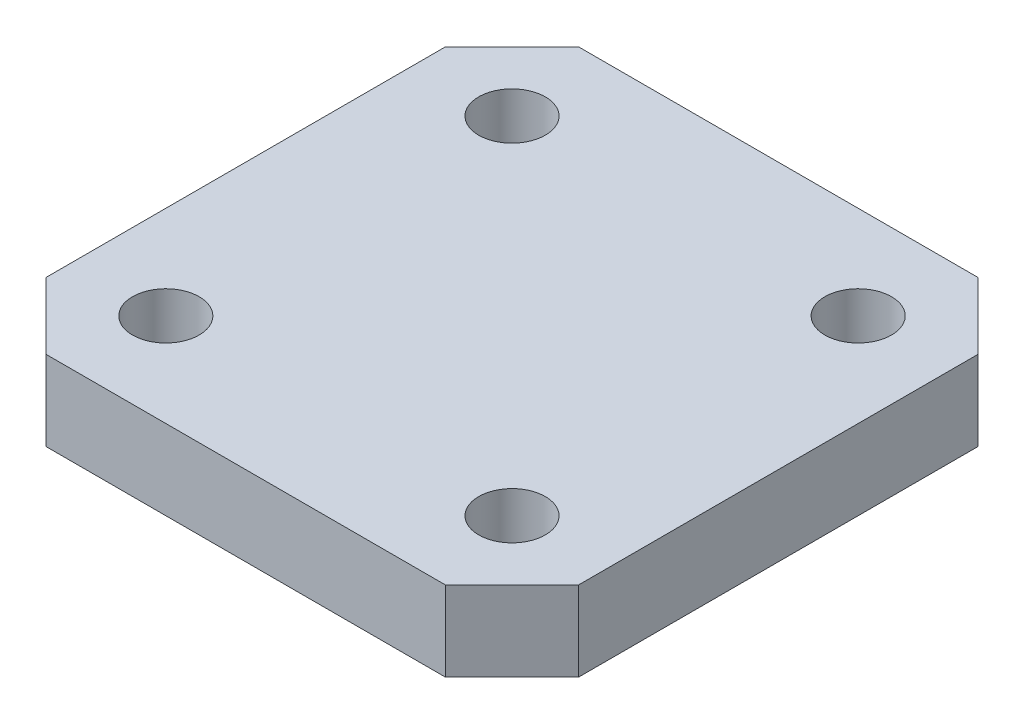
ISO-10303-21;
HEADER;
FILE_DESCRIPTION(('STEP AP214'),'2;1');
FILE_NAME('part.step','',(''),(''),'','','');
FILE_SCHEMA(('AUTOMOTIVE_DESIGN { 1 0 10303 214 1 1 1 1 }'));
ENDSEC;
DATA;
#1=APPLICATION_CONTEXT('core data for automotive mechanical design processes');
#2=APPLICATION_PROTOCOL_DEFINITION('international standard','automotive_design',2000,#1);
#3=PRODUCT_CONTEXT('',#1,'mechanical');
#4=PRODUCT('Part','Part','',(#3));
#5=PRODUCT_RELATED_PRODUCT_CATEGORY('part','',(#4));
#6=PRODUCT_DEFINITION_FORMATION('','',#4);
#7=PRODUCT_DEFINITION_CONTEXT('part definition',#1,'design');
#8=PRODUCT_DEFINITION('design','',#6,#7);
#9=PRODUCT_DEFINITION_SHAPE('','',#8);
#10=(LENGTH_UNIT() NAMED_UNIT(*) SI_UNIT(.MILLI.,.METRE.));
#11=(NAMED_UNIT(*) PLANE_ANGLE_UNIT() SI_UNIT($,.RADIAN.));
#12=(NAMED_UNIT(*) SI_UNIT($,.STERADIAN.) SOLID_ANGLE_UNIT());
#13=UNCERTAINTY_MEASURE_WITH_UNIT(LENGTH_MEASURE(1.E-05),#10,'distance_accuracy_value','');
#14=(GEOMETRIC_REPRESENTATION_CONTEXT(3) GLOBAL_UNCERTAINTY_ASSIGNED_CONTEXT((#13)) GLOBAL_UNIT_ASSIGNED_CONTEXT((#10,
#11,#12)) REPRESENTATION_CONTEXT('',''));
#15=CARTESIAN_POINT('',(0.,0.,0.));
#16=DIRECTION('',(0.,0.,1.));
#17=DIRECTION('',(1.,0.,0.));
#18=AXIS2_PLACEMENT_3D('',#15,#16,#17);
#19=CARTESIAN_POINT('',(-750.,930.,-880.));
#20=DIRECTION('',(0.,1.,0.));
#21=DIRECTION('',(0.,0.,1.));
#22=AXIS2_PLACEMENT_3D('',#19,#20,#21);
#23=PLANE('',#22);
#24=CARTESIAN_POINT('',(-763.,930.,-893.));
#25=DIRECTION('',(0.,1.,0.));
#26=DIRECTION('',(0.,0.,1.));
#27=AXIS2_PLACEMENT_3D('',#24,#25,#26);
#28=CIRCLE('',#27,2.49999999999995);
#29=CARTESIAN_POINT('',(-763.,930.,-890.5));
#30=VERTEX_POINT('',#29);
#31=EDGE_CURVE('E175',#30,#30,#28,.T.);
#32=ORIENTED_EDGE('',*,*,#31,.T.);
#33=EDGE_LOOP('',(#32));
#34=FACE_BOUND('',#33,.T.);
#35=CARTESIAN_POINT('',(-763.,930.,-867.));
#36=DIRECTION('',(0.,1.,0.));
#37=DIRECTION('',(0.,0.,1.));
#38=AXIS2_PLACEMENT_3D('',#35,#36,#37);
#39=CIRCLE('',#38,2.49999999999995);
#40=CARTESIAN_POINT('',(-763.,930.,-864.5));
#41=VERTEX_POINT('',#40);
#42=EDGE_CURVE('E237',#41,#41,#39,.T.);
#43=ORIENTED_EDGE('',*,*,#42,.T.);
#44=EDGE_LOOP('',(#43));
#45=FACE_BOUND('',#44,.T.);
#46=CARTESIAN_POINT('',(-737.,930.,-867.));
#47=DIRECTION('',(0.,1.,0.));
#48=DIRECTION('',(0.,0.,1.));
#49=AXIS2_PLACEMENT_3D('',#46,#47,#48);
#50=CIRCLE('',#49,2.49999999999995);
#51=CARTESIAN_POINT('',(-737.,930.,-864.5));
#52=VERTEX_POINT('',#51);
#53=EDGE_CURVE('E239',#52,#52,#50,.T.);
#54=ORIENTED_EDGE('',*,*,#53,.T.);
#55=EDGE_LOOP('',(#54));
#56=FACE_BOUND('',#55,.T.);
#57=CARTESIAN_POINT('',(-737.,930.,-893.));
#58=DIRECTION('',(0.,1.,0.));
#59=DIRECTION('',(0.,0.,1.));
#60=AXIS2_PLACEMENT_3D('',#57,#58,#59);
#61=CIRCLE('',#60,2.49999999999995);
#62=CARTESIAN_POINT('',(-737.,930.,-890.5));
#63=VERTEX_POINT('',#62);
#64=EDGE_CURVE('E48',#63,#63,#61,.T.);
#65=ORIENTED_EDGE('',*,*,#64,.T.);
#66=EDGE_LOOP('',(#65));
#67=FACE_BOUND('',#66,.T.);
#68=DIRECTION('',(1.,0.,0.));
#69=VECTOR('',#68,1.);
#70=CARTESIAN_POINT('',(-770.,930.,-900.));
#71=LINE('',#70,#69);
#72=CARTESIAN_POINT('',(-765.,930.,-900.));
#73=VERTEX_POINT('',#72);
#74=CARTESIAN_POINT('',(-735.,930.,-900.));
#75=VERTEX_POINT('',#74);
#76=EDGE_CURVE('E120',#73,#75,#71,.T.);
#77=ORIENTED_EDGE('',*,*,#76,.T.);
#78=DIRECTION('',(0.707106781186547,0.,0.707106781186549));
#79=VECTOR('',#78,1.);
#80=CARTESIAN_POINT('',(-735.,930.,-900.));
#81=LINE('',#80,#79);
#82=CARTESIAN_POINT('',(-730.,930.,-895.));
#83=VERTEX_POINT('',#82);
#84=EDGE_CURVE('E124',#75,#83,#81,.T.);
#85=ORIENTED_EDGE('',*,*,#84,.T.);
#86=DIRECTION('',(0.,0.,1.));
#87=VECTOR('',#86,1.);
#88=CARTESIAN_POINT('',(-730.,930.,-900.));
#89=LINE('',#88,#87);
#90=CARTESIAN_POINT('',(-730.,930.,-865.));
#91=VERTEX_POINT('',#90);
#92=EDGE_CURVE('E126',#83,#91,#89,.T.);
#93=ORIENTED_EDGE('',*,*,#92,.T.);
#94=DIRECTION('',(-0.707106781186549,0.,0.707106781186546));
#95=VECTOR('',#94,1.);
#96=CARTESIAN_POINT('',(-730.,930.,-865.));
#97=LINE('',#96,#95);
#98=CARTESIAN_POINT('',(-735.,930.,-860.));
#99=VERTEX_POINT('',#98);
#100=EDGE_CURVE('E179',#91,#99,#97,.T.);
#101=ORIENTED_EDGE('',*,*,#100,.T.);
#102=DIRECTION('',(-1.,0.,0.));
#103=VECTOR('',#102,1.);
#104=CARTESIAN_POINT('',(-770.,930.,-860.));
#105=LINE('',#104,#103);
#106=CARTESIAN_POINT('',(-765.,930.,-860.));
#107=VERTEX_POINT('',#106);
#108=EDGE_CURVE('E185',#99,#107,#105,.T.);
#109=ORIENTED_EDGE('',*,*,#108,.T.);
#110=DIRECTION('',(-0.707106781186546,0.,-0.707106781186549));
#111=VECTOR('',#110,1.);
#112=CARTESIAN_POINT('',(-765.,930.,-860.));
#113=LINE('',#112,#111);
#114=CARTESIAN_POINT('',(-770.,930.,-865.));
#115=VERTEX_POINT('',#114);
#116=EDGE_CURVE('E188',#107,#115,#113,.T.);
#117=ORIENTED_EDGE('',*,*,#116,.T.);
#118=DIRECTION('',(0.,0.,-1.));
#119=VECTOR('',#118,1.);
#120=CARTESIAN_POINT('',(-770.,930.,-900.));
#121=LINE('',#120,#119);
#122=CARTESIAN_POINT('',(-770.,930.,-895.));
#123=VERTEX_POINT('',#122);
#124=EDGE_CURVE('E192',#115,#123,#121,.T.);
#125=ORIENTED_EDGE('',*,*,#124,.T.);
#126=DIRECTION('',(0.707106781186548,0.,-0.707106781186547));
#127=VECTOR('',#126,1.);
#128=CARTESIAN_POINT('',(-770.,930.,-895.));
#129=LINE('',#128,#127);
#130=EDGE_CURVE('E154',#123,#73,#129,.T.);
#131=ORIENTED_EDGE('',*,*,#130,.T.);
#132=EDGE_LOOP('',(#77,#85,#93,#101,#109,#117,#125,#131));
#133=FACE_BOUND('',#132,.T.);
#134=ADVANCED_FACE('F45',(#34,#45,#56,#67,#133),#23,.F.);
#135=CARTESIAN_POINT('',(-730.,936.,-900.));
#136=DIRECTION('',(-1.,0.,0.));
#137=DIRECTION('',(0.,0.,1.));
#138=AXIS2_PLACEMENT_3D('',#135,#136,#137);
#139=PLANE('',#138);
#140=DIRECTION('',(0.,0.,1.));
#141=VECTOR('',#140,1.);
#142=CARTESIAN_POINT('',(-730.,936.,-880.));
#143=LINE('',#142,#141);
#144=CARTESIAN_POINT('',(-730.,936.,-865.));
#145=VERTEX_POINT('',#144);
#146=CARTESIAN_POINT('',(-730.,936.,-895.));
#147=VERTEX_POINT('',#146);
#148=EDGE_CURVE('E173',#145,#147,#143,.F.);
#149=ORIENTED_EDGE('',*,*,#148,.F.);
#150=DIRECTION('',(0.,1.,0.));
#151=VECTOR('',#150,1.);
#152=CARTESIAN_POINT('',(-730.,936.,-865.));
#153=LINE('',#152,#151);
#154=EDGE_CURVE('E137',#145,#91,#153,.F.);
#155=ORIENTED_EDGE('',*,*,#154,.T.);
#156=ORIENTED_EDGE('',*,*,#92,.F.);
#157=DIRECTION('',(0.,1.,0.));
#158=VECTOR('',#157,1.);
#159=CARTESIAN_POINT('',(-730.,936.,-895.));
#160=LINE('',#159,#158);
#161=EDGE_CURVE('E131',#83,#147,#160,.T.);
#162=ORIENTED_EDGE('',*,*,#161,.T.);
#163=EDGE_LOOP('',(#149,#155,#156,#162));
#164=FACE_BOUND('',#163,.T.);
#165=ADVANCED_FACE('F134',(#164),#139,.F.);
#166=CARTESIAN_POINT('',(-735.,936.,-900.));
#167=DIRECTION('',(-0.707106781186549,0.,0.707106781186547));
#168=DIRECTION('',(0.707106781186547,0.,0.707106781186549));
#169=AXIS2_PLACEMENT_3D('',#166,#167,#168);
#170=PLANE('',#169);
#171=ORIENTED_EDGE('',*,*,#84,.F.);
#172=DIRECTION('',(0.,1.,0.));
#173=VECTOR('',#172,1.);
#174=CARTESIAN_POINT('',(-735.,936.,-900.));
#175=LINE('',#174,#173);
#176=CARTESIAN_POINT('',(-735.,936.,-900.));
#177=VERTEX_POINT('',#176);
#178=EDGE_CURVE('E145',#75,#177,#175,.T.);
#179=ORIENTED_EDGE('',*,*,#178,.T.);
#180=DIRECTION('',(-0.707106781186548,0.,-0.707106781186548));
#181=VECTOR('',#180,1.);
#182=CARTESIAN_POINT('',(-730.,936.,-895.));
#183=LINE('',#182,#181);
#184=EDGE_CURVE('E142',#147,#177,#183,.T.);
#185=ORIENTED_EDGE('',*,*,#184,.F.);
#186=ORIENTED_EDGE('',*,*,#161,.F.);
#187=EDGE_LOOP('',(#171,#179,#185,#186));
#188=FACE_BOUND('',#187,.T.);
#189=ADVANCED_FACE('F140',(#188),#170,.F.);
#190=CARTESIAN_POINT('',(-770.,936.,-900.));
#191=DIRECTION('',(0.,0.,1.));
#192=DIRECTION('',(1.,0.,0.));
#193=AXIS2_PLACEMENT_3D('',#190,#191,#192);
#194=PLANE('',#193);
#195=DIRECTION('',(1.,0.,0.));
#196=VECTOR('',#195,1.);
#197=CARTESIAN_POINT('',(-750.,936.,-900.));
#198=LINE('',#197,#196);
#199=CARTESIAN_POINT('',(-765.,936.,-900.));
#200=VERTEX_POINT('',#199);
#201=EDGE_CURVE('E162',#177,#200,#198,.F.);
#202=ORIENTED_EDGE('',*,*,#201,.F.);
#203=ORIENTED_EDGE('',*,*,#178,.F.);
#204=ORIENTED_EDGE('',*,*,#76,.F.);
#205=DIRECTION('',(0.,1.,0.));
#206=VECTOR('',#205,1.);
#207=CARTESIAN_POINT('',(-765.,936.,-900.));
#208=LINE('',#207,#206);
#209=EDGE_CURVE('E157',#73,#200,#208,.T.);
#210=ORIENTED_EDGE('',*,*,#209,.T.);
#211=EDGE_LOOP('',(#202,#203,#204,#210));
#212=FACE_BOUND('',#211,.T.);
#213=ADVANCED_FACE('F163',(#212),#194,.F.);
#214=CARTESIAN_POINT('',(-770.,936.,-895.));
#215=DIRECTION('',(0.707106781186547,0.,0.707106781186548));
#216=DIRECTION('',(0.707106781186548,0.,-0.707106781186547));
#217=AXIS2_PLACEMENT_3D('',#214,#215,#216);
#218=PLANE('',#217);
#219=ORIENTED_EDGE('',*,*,#130,.F.);
#220=DIRECTION('',(0.,1.,0.));
#221=VECTOR('',#220,1.);
#222=CARTESIAN_POINT('',(-770.,936.,-895.));
#223=LINE('',#222,#221);
#224=CARTESIAN_POINT('',(-770.,936.,-895.));
#225=VERTEX_POINT('',#224);
#226=EDGE_CURVE('E191',#123,#225,#223,.T.);
#227=ORIENTED_EDGE('',*,*,#226,.T.);
#228=DIRECTION('',(-0.707106781186548,0.,0.707106781186548));
#229=VECTOR('',#228,1.);
#230=CARTESIAN_POINT('',(-765.,936.,-900.));
#231=LINE('',#230,#229);
#232=EDGE_CURVE('E168',#200,#225,#231,.T.);
#233=ORIENTED_EDGE('',*,*,#232,.F.);
#234=ORIENTED_EDGE('',*,*,#209,.F.);
#235=EDGE_LOOP('',(#219,#227,#233,#234));
#236=FACE_BOUND('',#235,.T.);
#237=ADVANCED_FACE('F211',(#236),#218,.F.);
#238=CARTESIAN_POINT('',(-770.,936.,-900.));
#239=DIRECTION('',(1.,0.,0.));
#240=DIRECTION('',(0.,0.,-1.));
#241=AXIS2_PLACEMENT_3D('',#238,#239,#240);
#242=PLANE('',#241);
#243=ORIENTED_EDGE('',*,*,#124,.F.);
#244=DIRECTION('',(0.,1.,0.));
#245=VECTOR('',#244,1.);
#246=CARTESIAN_POINT('',(-770.,936.,-865.));
#247=LINE('',#246,#245);
#248=CARTESIAN_POINT('',(-770.,936.,-865.));
#249=VERTEX_POINT('',#248);
#250=EDGE_CURVE('E187',#115,#249,#247,.T.);
#251=ORIENTED_EDGE('',*,*,#250,.T.);
#252=DIRECTION('',(0.,0.,1.));
#253=VECTOR('',#252,1.);
#254=CARTESIAN_POINT('',(-770.,936.,-880.));
#255=LINE('',#254,#253);
#256=EDGE_CURVE('E206',#225,#249,#255,.T.);
#257=ORIENTED_EDGE('',*,*,#256,.F.);
#258=ORIENTED_EDGE('',*,*,#226,.F.);
#259=EDGE_LOOP('',(#243,#251,#257,#258));
#260=FACE_BOUND('',#259,.T.);
#261=ADVANCED_FACE('F215',(#260),#242,.F.);
#262=CARTESIAN_POINT('',(-765.,936.,-860.));
#263=DIRECTION('',(0.707106781186549,0.,-0.707106781186546));
#264=DIRECTION('',(-0.707106781186546,0.,-0.707106781186549));
#265=AXIS2_PLACEMENT_3D('',#262,#263,#264);
#266=PLANE('',#265);
#267=ORIENTED_EDGE('',*,*,#116,.F.);
#268=DIRECTION('',(0.,1.,0.));
#269=VECTOR('',#268,1.);
#270=CARTESIAN_POINT('',(-765.,936.,-860.));
#271=LINE('',#270,#269);
#272=CARTESIAN_POINT('',(-765.,936.,-860.));
#273=VERTEX_POINT('',#272);
#274=EDGE_CURVE('E183',#107,#273,#271,.T.);
#275=ORIENTED_EDGE('',*,*,#274,.T.);
#276=DIRECTION('',(0.707106781186548,0.,0.707106781186548));
#277=VECTOR('',#276,1.);
#278=CARTESIAN_POINT('',(-770.,936.,-865.));
#279=LINE('',#278,#277);
#280=EDGE_CURVE('E203',#249,#273,#279,.T.);
#281=ORIENTED_EDGE('',*,*,#280,.F.);
#282=ORIENTED_EDGE('',*,*,#250,.F.);
#283=EDGE_LOOP('',(#267,#275,#281,#282));
#284=FACE_BOUND('',#283,.T.);
#285=ADVANCED_FACE('F220',(#284),#266,.F.);
#286=CARTESIAN_POINT('',(-770.,936.,-860.));
#287=DIRECTION('',(0.,0.,-1.));
#288=DIRECTION('',(-1.,0.,0.));
#289=AXIS2_PLACEMENT_3D('',#286,#287,#288);
#290=PLANE('',#289);
#291=DIRECTION('',(1.,0.,0.));
#292=VECTOR('',#291,1.);
#293=CARTESIAN_POINT('',(-750.,936.,-860.));
#294=LINE('',#293,#292);
#295=CARTESIAN_POINT('',(-735.,936.,-860.));
#296=VERTEX_POINT('',#295);
#297=EDGE_CURVE('E198',#273,#296,#294,.T.);
#298=ORIENTED_EDGE('',*,*,#297,.F.);
#299=ORIENTED_EDGE('',*,*,#274,.F.);
#300=ORIENTED_EDGE('',*,*,#108,.F.);
#301=DIRECTION('',(0.,1.,0.));
#302=VECTOR('',#301,1.);
#303=CARTESIAN_POINT('',(-735.,936.,-860.));
#304=LINE('',#303,#302);
#305=EDGE_CURVE('E66',#99,#296,#304,.T.);
#306=ORIENTED_EDGE('',*,*,#305,.T.);
#307=EDGE_LOOP('',(#298,#299,#300,#306));
#308=FACE_BOUND('',#307,.T.);
#309=ADVANCED_FACE('F222',(#308),#290,.F.);
#310=CARTESIAN_POINT('',(-730.,936.,-865.));
#311=DIRECTION('',(-0.707106781186546,0.,-0.707106781186549));
#312=DIRECTION('',(-0.707106781186549,0.,0.707106781186546));
#313=AXIS2_PLACEMENT_3D('',#310,#311,#312);
#314=PLANE('',#313);
#315=ORIENTED_EDGE('',*,*,#100,.F.);
#316=ORIENTED_EDGE('',*,*,#154,.F.);
#317=DIRECTION('',(0.707106781186548,0.,-0.707106781186548));
#318=VECTOR('',#317,1.);
#319=CARTESIAN_POINT('',(-735.,936.,-860.));
#320=LINE('',#319,#318);
#321=EDGE_CURVE('E202',#296,#145,#320,.T.);
#322=ORIENTED_EDGE('',*,*,#321,.F.);
#323=ORIENTED_EDGE('',*,*,#305,.F.);
#324=EDGE_LOOP('',(#315,#316,#322,#323));
#325=FACE_BOUND('',#324,.T.);
#326=ADVANCED_FACE('F224',(#325),#314,.F.);
#327=CARTESIAN_POINT('',(-737.,936.,-893.));
#328=DIRECTION('',(0.,1.,0.));
#329=DIRECTION('',(0.,0.,1.));
#330=AXIS2_PLACEMENT_3D('',#327,#328,#329);
#331=CYLINDRICAL_SURFACE('',#330,2.49999999999995);
#332=ORIENTED_EDGE('',*,*,#64,.F.);
#333=EDGE_LOOP('',(#332));
#334=FACE_BOUND('',#333,.T.);
#335=CARTESIAN_POINT('',(-737.,936.,-893.));
#336=DIRECTION('',(0.,1.,0.));
#337=DIRECTION('',(0.,0.,1.));
#338=AXIS2_PLACEMENT_3D('',#335,#336,#337);
#339=CIRCLE('',#338,2.49999999999995);
#340=CARTESIAN_POINT('',(-737.,936.,-890.5));
#341=VERTEX_POINT('',#340);
#342=EDGE_CURVE('E225',#341,#341,#339,.F.);
#343=ORIENTED_EDGE('',*,*,#342,.F.);
#344=EDGE_LOOP('',(#343));
#345=FACE_BOUND('',#344,.T.);
#346=ADVANCED_FACE('F247',(#334,#345),#331,.F.);
#347=CARTESIAN_POINT('',(-737.,936.,-867.));
#348=DIRECTION('',(0.,1.,0.));
#349=DIRECTION('',(0.,0.,1.));
#350=AXIS2_PLACEMENT_3D('',#347,#348,#349);
#351=CYLINDRICAL_SURFACE('',#350,2.49999999999995);
#352=ORIENTED_EDGE('',*,*,#53,.F.);
#353=EDGE_LOOP('',(#352));
#354=FACE_BOUND('',#353,.T.);
#355=CARTESIAN_POINT('',(-737.,936.,-867.));
#356=DIRECTION('',(0.,1.,0.));
#357=DIRECTION('',(0.,0.,1.));
#358=AXIS2_PLACEMENT_3D('',#355,#356,#357);
#359=CIRCLE('',#358,2.49999999999995);
#360=CARTESIAN_POINT('',(-737.,936.,-864.5));
#361=VERTEX_POINT('',#360);
#362=EDGE_CURVE('E227',#361,#361,#359,.F.);
#363=ORIENTED_EDGE('',*,*,#362,.F.);
#364=EDGE_LOOP('',(#363));
#365=FACE_BOUND('',#364,.T.);
#366=ADVANCED_FACE('F250',(#354,#365),#351,.F.);
#367=CARTESIAN_POINT('',(-763.,936.,-867.));
#368=DIRECTION('',(0.,1.,0.));
#369=DIRECTION('',(0.,0.,1.));
#370=AXIS2_PLACEMENT_3D('',#367,#368,#369);
#371=CYLINDRICAL_SURFACE('',#370,2.49999999999995);
#372=ORIENTED_EDGE('',*,*,#42,.F.);
#373=EDGE_LOOP('',(#372));
#374=FACE_BOUND('',#373,.T.);
#375=CARTESIAN_POINT('',(-763.,936.,-867.));
#376=DIRECTION('',(0.,1.,0.));
#377=DIRECTION('',(0.,0.,1.));
#378=AXIS2_PLACEMENT_3D('',#375,#376,#377);
#379=CIRCLE('',#378,2.49999999999995);
#380=CARTESIAN_POINT('',(-763.,936.,-864.5));
#381=VERTEX_POINT('',#380);
#382=EDGE_CURVE('E54',#381,#381,#379,.F.);
#383=ORIENTED_EDGE('',*,*,#382,.F.);
#384=EDGE_LOOP('',(#383));
#385=FACE_BOUND('',#384,.T.);
#386=ADVANCED_FACE('F256',(#374,#385),#371,.F.);
#387=CARTESIAN_POINT('',(-763.,936.,-893.));
#388=DIRECTION('',(0.,1.,0.));
#389=DIRECTION('',(0.,0.,1.));
#390=AXIS2_PLACEMENT_3D('',#387,#388,#389);
#391=CYLINDRICAL_SURFACE('',#390,2.49999999999995);
#392=ORIENTED_EDGE('',*,*,#31,.F.);
#393=EDGE_LOOP('',(#392));
#394=FACE_BOUND('',#393,.T.);
#395=CARTESIAN_POINT('',(-763.,936.,-893.));
#396=DIRECTION('',(0.,1.,0.));
#397=DIRECTION('',(0.,0.,1.));
#398=AXIS2_PLACEMENT_3D('',#395,#396,#397);
#399=CIRCLE('',#398,2.49999999999995);
#400=CARTESIAN_POINT('',(-763.,936.,-890.5));
#401=VERTEX_POINT('',#400);
#402=EDGE_CURVE('E12',#401,#401,#399,.F.);
#403=ORIENTED_EDGE('',*,*,#402,.F.);
#404=EDGE_LOOP('',(#403));
#405=FACE_BOUND('',#404,.T.);
#406=ADVANCED_FACE('F261',(#394,#405),#391,.F.);
#407=CARTESIAN_POINT('',(-750.,936.,-880.));
#408=DIRECTION('',(0.,1.,0.));
#409=DIRECTION('',(0.,0.,1.));
#410=AXIS2_PLACEMENT_3D('',#407,#408,#409);
#411=PLANE('',#410);
#412=ORIENTED_EDGE('',*,*,#402,.T.);
#413=EDGE_LOOP('',(#412));
#414=FACE_BOUND('',#413,.T.);
#415=ORIENTED_EDGE('',*,*,#382,.T.);
#416=EDGE_LOOP('',(#415));
#417=FACE_BOUND('',#416,.T.);
#418=ORIENTED_EDGE('',*,*,#362,.T.);
#419=EDGE_LOOP('',(#418));
#420=FACE_BOUND('',#419,.T.);
#421=ORIENTED_EDGE('',*,*,#342,.T.);
#422=EDGE_LOOP('',(#421));
#423=FACE_BOUND('',#422,.T.);
#424=ORIENTED_EDGE('',*,*,#297,.T.);
#425=ORIENTED_EDGE('',*,*,#321,.T.);
#426=ORIENTED_EDGE('',*,*,#148,.T.);
#427=ORIENTED_EDGE('',*,*,#184,.T.);
#428=ORIENTED_EDGE('',*,*,#201,.T.);
#429=ORIENTED_EDGE('',*,*,#232,.T.);
#430=ORIENTED_EDGE('',*,*,#256,.T.);
#431=ORIENTED_EDGE('',*,*,#280,.T.);
#432=EDGE_LOOP('',(#424,#425,#426,#427,#428,#429,#430,#431));
#433=FACE_BOUND('',#432,.T.);
#434=ADVANCED_FACE('F171',(#414,#417,#420,#423,#433),#411,.T.);
#435=CLOSED_SHELL('',(#134,#165,#189,#213,#237,#261,#285,#309,#326,#346,#366,#386,#406,#434));
#436=MANIFOLD_SOLID_BREP('B2',#435);
#437=ADVANCED_BREP_SHAPE_REPRESENTATION('',(#18,#436),#14);
#438=SHAPE_DEFINITION_REPRESENTATION(#9,#437);
ENDSEC;
END-ISO-10303-21;
